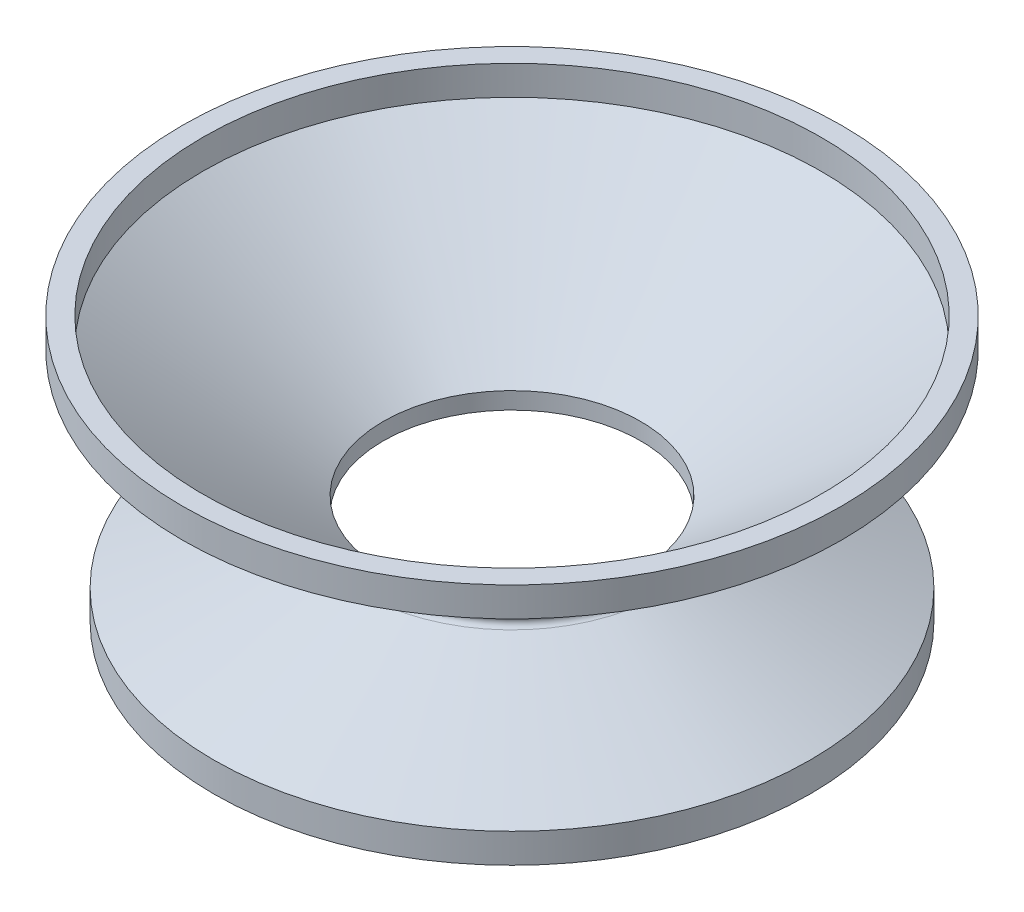
ISO-10303-21;
HEADER;
FILE_DESCRIPTION(('STEP AP214'),'2;1');
FILE_NAME('part.step','',(''),(''),'','','');
FILE_SCHEMA(('AUTOMOTIVE_DESIGN { 1 0 10303 214 1 1 1 1 }'));
ENDSEC;
DATA;
#1=APPLICATION_CONTEXT('core data for automotive mechanical design processes');
#2=APPLICATION_PROTOCOL_DEFINITION('international standard','automotive_design',2000,#1);
#3=PRODUCT_CONTEXT('',#1,'mechanical');
#4=PRODUCT('Part','Part','',(#3));
#5=PRODUCT_RELATED_PRODUCT_CATEGORY('part','',(#4));
#6=PRODUCT_DEFINITION_FORMATION('','',#4);
#7=PRODUCT_DEFINITION_CONTEXT('part definition',#1,'design');
#8=PRODUCT_DEFINITION('design','',#6,#7);
#9=PRODUCT_DEFINITION_SHAPE('','',#8);
#10=(LENGTH_UNIT() NAMED_UNIT(*) SI_UNIT(.MILLI.,.METRE.));
#11=(NAMED_UNIT(*) PLANE_ANGLE_UNIT() SI_UNIT($,.RADIAN.));
#12=(NAMED_UNIT(*) SI_UNIT($,.STERADIAN.) SOLID_ANGLE_UNIT());
#13=UNCERTAINTY_MEASURE_WITH_UNIT(LENGTH_MEASURE(1.E-05),#10,'distance_accuracy_value','');
#14=(GEOMETRIC_REPRESENTATION_CONTEXT(3) GLOBAL_UNCERTAINTY_ASSIGNED_CONTEXT((#13)) GLOBAL_UNIT_ASSIGNED_CONTEXT((#10,
#11,#12)) REPRESENTATION_CONTEXT('',''));
#15=CARTESIAN_POINT('',(0.,0.,0.));
#16=DIRECTION('',(0.,0.,1.));
#17=DIRECTION('',(1.,0.,0.));
#18=AXIS2_PLACEMENT_3D('',#15,#16,#17);
#19=CARTESIAN_POINT('',(10.2042073284517,0.,0.));
#20=DIRECTION('',(0.,-1.,0.));
#21=DIRECTION('',(1.,0.,0.));
#22=AXIS2_PLACEMENT_3D('',#19,#20,#21);
#23=CONICAL_SURFACE('',#22,9.54142537581771,1.13446401379632);
#24=CARTESIAN_POINT('',(10.2042073284517,-0.292798520616533,0.));
#25=DIRECTION('',(0.,-1.,0.));
#26=DIRECTION('',(1.,0.,0.));
#27=AXIS2_PLACEMENT_3D('',#24,#25,#26);
#28=CIRCLE('',#27,10.1693338295948);
#29=CARTESIAN_POINT('',(20.3735411580465,-0.292798520616532,0.));
#30=VERTEX_POINT('',#29);
#31=EDGE_CURVE('E10',#30,#30,#28,.T.);
#32=ORIENTED_EDGE('',*,*,#31,.T.);
#33=EDGE_LOOP('',(#32));
#34=FACE_BOUND('',#33,.T.);
#35=CARTESIAN_POINT('',(10.2042073284517,-5.,0.));
#36=DIRECTION('',(0.,-1.,0.));
#37=DIRECTION('',(1.,0.,0.));
#38=AXIS2_PLACEMENT_3D('',#35,#36,#37);
#39=CIRCLE('',#38,20.2639599783657);
#40=CARTESIAN_POINT('',(30.4681673068173,-5.,0.));
#41=VERTEX_POINT('',#40);
#42=EDGE_CURVE('E88',#41,#41,#39,.T.);
#43=ORIENTED_EDGE('',*,*,#42,.F.);
#44=EDGE_LOOP('',(#43));
#45=FACE_BOUND('',#44,.T.);
#46=ADVANCED_FACE('F43',(#34,#45),#23,.T.);
#47=CARTESIAN_POINT('',(10.2042073284517,9.,0.));
#48=DIRECTION('',(0.,1.,0.));
#49=DIRECTION('',(-1.,0.,0.));
#50=AXIS2_PLACEMENT_3D('',#47,#48,#49);
#51=CONICAL_SURFACE('',#50,22.3947574364969,0.959931088596887);
#52=CARTESIAN_POINT('',(10.2042073284517,0.397385411913727,0.));
#53=DIRECTION('',(0.,1.,0.));
#54=DIRECTION('',(-1.,0.,0.));
#55=AXIS2_PLACEMENT_3D('',#52,#53,#54);
#56=CIRCLE('',#55,10.1089505597507);
#57=CARTESIAN_POINT('',(0.0952567687009746,0.397385411913726,0.));
#58=VERTEX_POINT('',#57);
#59=EDGE_CURVE('E51',#58,#58,#56,.T.);
#60=ORIENTED_EDGE('',*,*,#59,.T.);
#61=EDGE_LOOP('',(#60));
#62=FACE_BOUND('',#61,.T.);
#63=CARTESIAN_POINT('',(10.2042073284517,9.,0.));
#64=DIRECTION('',(0.,1.,0.));
#65=DIRECTION('',(-1.,0.,0.));
#66=AXIS2_PLACEMENT_3D('',#63,#64,#65);
#67=CIRCLE('',#66,22.3947574364969);
#68=CARTESIAN_POINT('',(-12.1905501080452,9.,0.));
#69=VERTEX_POINT('',#68);
#70=EDGE_CURVE('E56',#69,#69,#67,.T.);
#71=ORIENTED_EDGE('',*,*,#70,.F.);
#72=EDGE_LOOP('',(#71));
#73=FACE_BOUND('',#72,.T.);
#74=ADVANCED_FACE('F120',(#62,#73),#51,.T.);
#75=CARTESIAN_POINT('',(10.2042073284517,0.416453640441402,0.));
#76=DIRECTION('',(0.,1.,0.));
#77=DIRECTION('',(-1.,0.,0.));
#78=AXIS2_PLACEMENT_3D('',#75,#76,#77);
#79=CONICAL_SURFACE('',#78,8.74142537581771,0.959931088596887);
#80=CARTESIAN_POINT('',(10.2042073284517,9.,0.));
#81=DIRECTION('',(0.,1.,0.));
#82=DIRECTION('',(-1.,0.,0.));
#83=AXIS2_PLACEMENT_3D('',#80,#81,#82);
#84=CIRCLE('',#83,21.);
#85=CARTESIAN_POINT('',(-10.7957926715483,9.,0.));
#86=VERTEX_POINT('',#85);
#87=EDGE_CURVE('E80',#86,#86,#84,.T.);
#88=ORIENTED_EDGE('',*,*,#87,.T.);
#89=EDGE_LOOP('',(#88));
#90=FACE_BOUND('',#89,.T.);
#91=CARTESIAN_POINT('',(10.2042073284517,0.416453640441402,0.));
#92=DIRECTION('',(0.,1.,0.));
#93=DIRECTION('',(-1.,0.,0.));
#94=AXIS2_PLACEMENT_3D('',#91,#92,#93);
#95=CIRCLE('',#94,8.74142537581771);
#96=CARTESIAN_POINT('',(1.46278195263397,0.416453640441401,0.));
#97=VERTEX_POINT('',#96);
#98=EDGE_CURVE('E61',#97,#97,#95,.T.);
#99=ORIENTED_EDGE('',*,*,#98,.F.);
#100=EDGE_LOOP('',(#99));
#101=FACE_BOUND('',#100,.T.);
#102=ADVANCED_FACE('F125',(#90,#101),#79,.F.);
#103=CARTESIAN_POINT('',(10.2042073284517,8.60901803281974,0.));
#104=DIRECTION('',(0.,1.,0.));
#105=DIRECTION('',(-1.,0.,0.));
#106=AXIS2_PLACEMENT_3D('',#103,#104,#105);
#107=CYLINDRICAL_SURFACE('',#106,8.74142537581771);
#108=ORIENTED_EDGE('',*,*,#98,.T.);
#109=EDGE_LOOP('',(#108));
#110=FACE_BOUND('',#109,.T.);
#111=CARTESIAN_POINT('',(10.2042073284517,-0.730331792438494,0.));
#112=DIRECTION('',(0.,1.,0.));
#113=DIRECTION('',(-1.,0.,0.));
#114=AXIS2_PLACEMENT_3D('',#111,#112,#113);
#115=CIRCLE('',#114,8.74142537581771);
#116=CARTESIAN_POINT('',(1.46278195263397,-0.730331792438495,0.));
#117=VERTEX_POINT('',#116);
#118=EDGE_CURVE('E67',#117,#117,#115,.T.);
#119=ORIENTED_EDGE('',*,*,#118,.F.);
#120=EDGE_LOOP('',(#119));
#121=FACE_BOUND('',#120,.T.);
#122=ADVANCED_FACE('F131',(#110,#121),#107,.F.);
#123=CARTESIAN_POINT('',(10.2042073284517,-5.,0.));
#124=DIRECTION('',(0.,-1.,0.));
#125=DIRECTION('',(1.,0.,0.));
#126=AXIS2_PLACEMENT_3D('',#123,#124,#125);
#127=CONICAL_SURFACE('',#126,17.8977583952131,1.13446401379632);
#128=ORIENTED_EDGE('',*,*,#118,.T.);
#129=EDGE_LOOP('',(#128));
#130=FACE_BOUND('',#129,.T.);
#131=CARTESIAN_POINT('',(10.2042073284517,-5.,0.));
#132=DIRECTION('',(0.,1.,0.));
#133=DIRECTION('',(-1.,0.,0.));
#134=AXIS2_PLACEMENT_3D('',#131,#132,#133);
#135=CIRCLE('',#134,17.8977583952131);
#136=CARTESIAN_POINT('',(-7.69355106676147,-5.,0.));
#137=VERTEX_POINT('',#136);
#138=EDGE_CURVE('E71',#137,#137,#135,.T.);
#139=ORIENTED_EDGE('',*,*,#138,.F.);
#140=EDGE_LOOP('',(#139));
#141=FACE_BOUND('',#140,.T.);
#142=ADVANCED_FACE('F135',(#130,#141),#127,.F.);
#143=CARTESIAN_POINT('',(10.2042073284517,0.0697245941981275,0.));
#144=DIRECTION('',(0.,1.,0.));
#145=DIRECTION('',(-1.,0.,0.));
#146=AXIS2_PLACEMENT_3D('',#143,#144,#145);
#147=TOROIDAL_SURFACE('',#146,10.3383811342911,0.4);
#148=ORIENTED_EDGE('',*,*,#31,.F.);
#149=EDGE_LOOP('',(#148));
#150=FACE_BOUND('',#149,.T.);
#151=ORIENTED_EDGE('',*,*,#59,.F.);
#152=EDGE_LOOP('',(#151));
#153=FACE_BOUND('',#152,.T.);
#154=ADVANCED_FACE('F45',(#150,#153),#147,.F.);
#155=CARTESIAN_POINT('',(10.2042073284517,11.,0.));
#156=DIRECTION('',(0.,1.,0.));
#157=DIRECTION('',(-1.,0.,0.));
#158=AXIS2_PLACEMENT_3D('',#155,#156,#157);
#159=PLANE('',#158);
#160=CARTESIAN_POINT('',(10.2042073284517,11.,0.));
#161=DIRECTION('',(0.,1.,0.));
#162=DIRECTION('',(-1.,0.,0.));
#163=AXIS2_PLACEMENT_3D('',#160,#161,#162);
#164=CIRCLE('',#163,22.3947574364969);
#165=CARTESIAN_POINT('',(-12.1905501080452,11.,0.));
#166=VERTEX_POINT('',#165);
#167=EDGE_CURVE('E75',#166,#166,#164,.T.);
#168=ORIENTED_EDGE('',*,*,#167,.T.);
#169=EDGE_LOOP('',(#168));
#170=FACE_BOUND('',#169,.T.);
#171=CARTESIAN_POINT('',(10.2042073284517,11.,0.));
#172=DIRECTION('',(0.,1.,0.));
#173=DIRECTION('',(-1.,0.,0.));
#174=AXIS2_PLACEMENT_3D('',#171,#172,#173);
#175=CIRCLE('',#174,21.);
#176=CARTESIAN_POINT('',(-10.7957926715483,11.,0.));
#177=VERTEX_POINT('',#176);
#178=EDGE_CURVE('E79',#177,#177,#175,.T.);
#179=ORIENTED_EDGE('',*,*,#178,.F.);
#180=EDGE_LOOP('',(#179));
#181=FACE_BOUND('',#180,.T.);
#182=ADVANCED_FACE('F141',(#170,#181),#159,.T.);
#183=CARTESIAN_POINT('',(10.2042073284517,11.,0.));
#184=DIRECTION('',(0.,-1.,0.));
#185=DIRECTION('',(1.,0.,0.));
#186=AXIS2_PLACEMENT_3D('',#183,#184,#185);
#187=CYLINDRICAL_SURFACE('',#186,22.3947574364969);
#188=ORIENTED_EDGE('',*,*,#167,.F.);
#189=EDGE_LOOP('',(#188));
#190=FACE_BOUND('',#189,.T.);
#191=ORIENTED_EDGE('',*,*,#70,.T.);
#192=EDGE_LOOP('',(#191));
#193=FACE_BOUND('',#192,.T.);
#194=ADVANCED_FACE('F115',(#190,#193),#187,.T.);
#195=CARTESIAN_POINT('',(10.2042073284517,11.,0.));
#196=DIRECTION('',(0.,-1.,0.));
#197=DIRECTION('',(1.,0.,0.));
#198=AXIS2_PLACEMENT_3D('',#195,#196,#197);
#199=CYLINDRICAL_SURFACE('',#198,21.);
#200=ORIENTED_EDGE('',*,*,#178,.T.);
#201=EDGE_LOOP('',(#200));
#202=FACE_BOUND('',#201,.T.);
#203=ORIENTED_EDGE('',*,*,#87,.F.);
#204=EDGE_LOOP('',(#203));
#205=FACE_BOUND('',#204,.T.);
#206=ADVANCED_FACE('F106',(#202,#205),#199,.F.);
#207=CARTESIAN_POINT('',(10.2042073284517,-6.99999999999999,0.));
#208=DIRECTION('',(0.,-1.,0.));
#209=DIRECTION('',(1.,0.,0.));
#210=AXIS2_PLACEMENT_3D('',#207,#208,#209);
#211=PLANE('',#210);
#212=CARTESIAN_POINT('',(10.2042073284517,-6.99999999999999,0.));
#213=DIRECTION('',(0.,-1.,0.));
#214=DIRECTION('',(1.,0.,0.));
#215=AXIS2_PLACEMENT_3D('',#212,#213,#214);
#216=CIRCLE('',#215,20.2639599783657);
#217=CARTESIAN_POINT('',(30.4681673068173,-6.99999999999999,0.));
#218=VERTEX_POINT('',#217);
#219=EDGE_CURVE('E84',#218,#218,#216,.T.);
#220=ORIENTED_EDGE('',*,*,#219,.T.);
#221=EDGE_LOOP('',(#220));
#222=FACE_BOUND('',#221,.T.);
#223=CARTESIAN_POINT('',(10.2042073284517,-6.99999999999999,0.));
#224=DIRECTION('',(0.,-1.,0.));
#225=DIRECTION('',(1.,0.,0.));
#226=AXIS2_PLACEMENT_3D('',#223,#224,#225);
#227=CIRCLE('',#226,17.8977583952131);
#228=CARTESIAN_POINT('',(28.1019657236648,-6.99999999999999,0.));
#229=VERTEX_POINT('',#228);
#230=EDGE_CURVE('E92',#229,#229,#227,.T.);
#231=ORIENTED_EDGE('',*,*,#230,.F.);
#232=EDGE_LOOP('',(#231));
#233=FACE_BOUND('',#232,.T.);
#234=ADVANCED_FACE('F103',(#222,#233),#211,.T.);
#235=CARTESIAN_POINT('',(10.2042073284517,-6.99999999999999,0.));
#236=DIRECTION('',(0.,1.,0.));
#237=DIRECTION('',(-1.,0.,0.));
#238=AXIS2_PLACEMENT_3D('',#235,#236,#237);
#239=CYLINDRICAL_SURFACE('',#238,20.2639599783657);
#240=ORIENTED_EDGE('',*,*,#219,.F.);
#241=EDGE_LOOP('',(#240));
#242=FACE_BOUND('',#241,.T.);
#243=ORIENTED_EDGE('',*,*,#42,.T.);
#244=EDGE_LOOP('',(#243));
#245=FACE_BOUND('',#244,.T.);
#246=ADVANCED_FACE('F105',(#242,#245),#239,.T.);
#247=CARTESIAN_POINT('',(10.2042073284517,-6.99999999999999,0.));
#248=DIRECTION('',(0.,1.,0.));
#249=DIRECTION('',(-1.,0.,0.));
#250=AXIS2_PLACEMENT_3D('',#247,#248,#249);
#251=CYLINDRICAL_SURFACE('',#250,17.8977583952131);
#252=ORIENTED_EDGE('',*,*,#230,.T.);
#253=EDGE_LOOP('',(#252));
#254=FACE_BOUND('',#253,.T.);
#255=ORIENTED_EDGE('',*,*,#138,.T.);
#256=EDGE_LOOP('',(#255));
#257=FACE_BOUND('',#256,.T.);
#258=ADVANCED_FACE('F100',(#254,#257),#251,.F.);
#259=CLOSED_SHELL('',(#46,#74,#102,#122,#142,#154,#182,#194,#206,#234,#246,#258));
#260=MANIFOLD_SOLID_BREP('B2',#259);
#261=ADVANCED_BREP_SHAPE_REPRESENTATION('',(#18,#260),#14);
#262=SHAPE_DEFINITION_REPRESENTATION(#9,#261);
ENDSEC;
END-ISO-10303-21;
